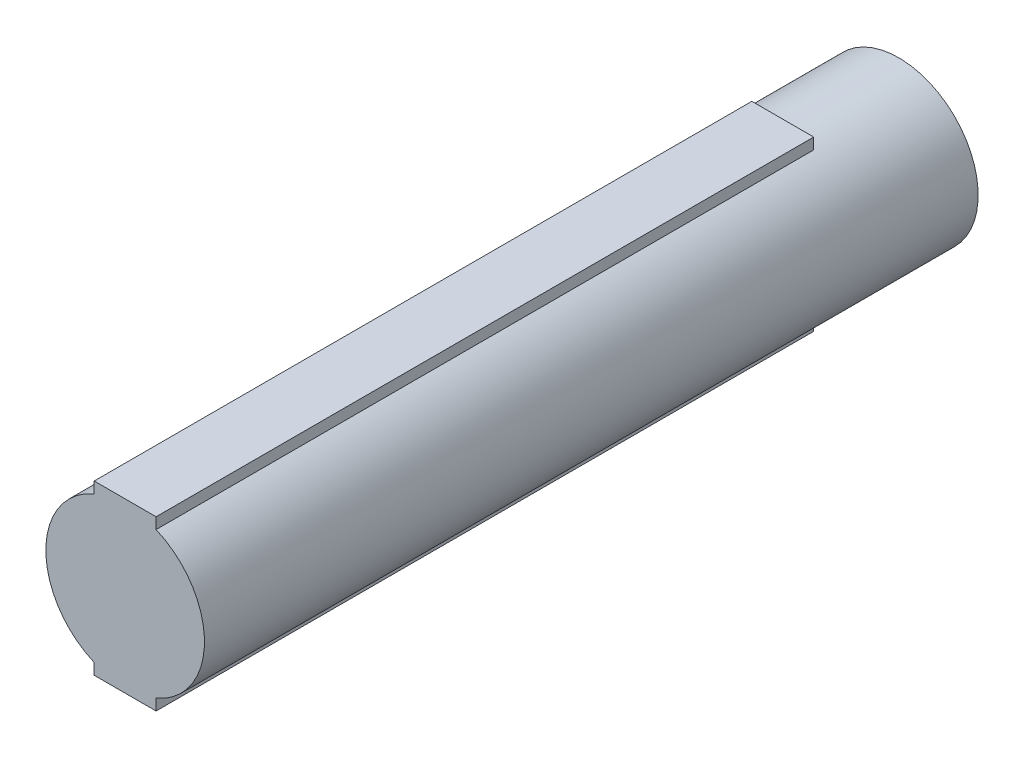
ISO-10303-21;
HEADER;
FILE_DESCRIPTION(('STEP AP214'),'2;1');
FILE_NAME('part.step','',(''),(''),'','','');
FILE_SCHEMA(('AUTOMOTIVE_DESIGN { 1 0 10303 214 1 1 1 1 }'));
ENDSEC;
DATA;
#1=APPLICATION_CONTEXT('core data for automotive mechanical design processes');
#2=APPLICATION_PROTOCOL_DEFINITION('international standard','automotive_design',2000,#1);
#3=PRODUCT_CONTEXT('',#1,'mechanical');
#4=PRODUCT('Part','Part','',(#3));
#5=PRODUCT_RELATED_PRODUCT_CATEGORY('part','',(#4));
#6=PRODUCT_DEFINITION_FORMATION('','',#4);
#7=PRODUCT_DEFINITION_CONTEXT('part definition',#1,'design');
#8=PRODUCT_DEFINITION('design','',#6,#7);
#9=PRODUCT_DEFINITION_SHAPE('','',#8);
#10=(LENGTH_UNIT() NAMED_UNIT(*) SI_UNIT(.MILLI.,.METRE.));
#11=(NAMED_UNIT(*) PLANE_ANGLE_UNIT() SI_UNIT($,.RADIAN.));
#12=(NAMED_UNIT(*) SI_UNIT($,.STERADIAN.) SOLID_ANGLE_UNIT());
#13=UNCERTAINTY_MEASURE_WITH_UNIT(LENGTH_MEASURE(1.E-05),#10,'distance_accuracy_value','');
#14=(GEOMETRIC_REPRESENTATION_CONTEXT(3) GLOBAL_UNCERTAINTY_ASSIGNED_CONTEXT((#13)) GLOBAL_UNIT_ASSIGNED_CONTEXT((#10,
#11,#12)) REPRESENTATION_CONTEXT('',''));
#15=CARTESIAN_POINT('',(0.,0.,0.));
#16=DIRECTION('',(0.,0.,1.));
#17=DIRECTION('',(1.,0.,0.));
#18=AXIS2_PLACEMENT_3D('',#15,#16,#17);
#19=CARTESIAN_POINT('',(0.,0.,0.));
#20=DIRECTION('',(0.,0.,1.));
#21=DIRECTION('',(1.,0.,0.));
#22=AXIS2_PLACEMENT_3D('',#19,#20,#21);
#23=CYLINDRICAL_SURFACE('',#22,2.05);
#24=CARTESIAN_POINT('',(0.,0.,-9.));
#25=DIRECTION('',(0.,0.,-1.));
#26=DIRECTION('',(-1.,0.,0.));
#27=AXIS2_PLACEMENT_3D('',#24,#25,#26);
#28=CIRCLE('',#27,2.05);
#29=CARTESIAN_POINT('',(-2.05,0.,-9.));
#30=VERTEX_POINT('',#29);
#31=EDGE_CURVE('E205',#30,#30,#28,.T.);
#32=ORIENTED_EDGE('',*,*,#31,.F.);
#33=EDGE_LOOP('',(#32));
#34=FACE_BOUND('',#33,.T.);
#35=CARTESIAN_POINT('',(0.,0.,-6.));
#36=DIRECTION('',(0.,0.,1.));
#37=DIRECTION('',(-1.,0.,0.));
#38=AXIS2_PLACEMENT_3D('',#35,#36,#37);
#39=CIRCLE('',#38,2.05);
#40=CARTESIAN_POINT('',(-0.800000000000007,-1.88745860881768,-6.));
#41=VERTEX_POINT('',#40);
#42=CARTESIAN_POINT('',(0.799999999999994,-1.88745860881769,-6.));
#43=VERTEX_POINT('',#42);
#44=EDGE_CURVE('E169',#41,#43,#39,.T.);
#45=ORIENTED_EDGE('',*,*,#44,.F.);
#46=DIRECTION('',(0.,0.,-1.));
#47=VECTOR('',#46,1.);
#48=CARTESIAN_POINT('',(-0.800000000000007,-1.88745860881768,11.));
#49=LINE('',#48,#47);
#50=CARTESIAN_POINT('',(-0.800000000000007,-1.88745860881768,11.));
#51=VERTEX_POINT('',#50);
#52=EDGE_CURVE('E158',#51,#41,#49,.T.);
#53=ORIENTED_EDGE('',*,*,#52,.F.);
#54=CARTESIAN_POINT('',(0.,0.,11.));
#55=DIRECTION('',(0.,0.,1.));
#56=DIRECTION('',(1.,0.,0.));
#57=AXIS2_PLACEMENT_3D('',#54,#55,#56);
#58=CIRCLE('',#57,2.05);
#59=CARTESIAN_POINT('',(-0.800000000000007,1.88745860881768,11.));
#60=VERTEX_POINT('',#59);
#61=EDGE_CURVE('E256',#60,#51,#58,.T.);
#62=ORIENTED_EDGE('',*,*,#61,.F.);
#63=DIRECTION('',(0.,0.,-1.));
#64=VECTOR('',#63,1.);
#65=CARTESIAN_POINT('',(-0.800000000000007,1.88745860881768,11.));
#66=LINE('',#65,#64);
#67=CARTESIAN_POINT('',(-0.800000000000007,1.88745860881768,-6.));
#68=VERTEX_POINT('',#67);
#69=EDGE_CURVE('E224',#60,#68,#66,.T.);
#70=ORIENTED_EDGE('',*,*,#69,.T.);
#71=CARTESIAN_POINT('',(0.,0.,-6.));
#72=DIRECTION('',(0.,0.,1.));
#73=DIRECTION('',(-1.,0.,0.));
#74=AXIS2_PLACEMENT_3D('',#71,#72,#73);
#75=CIRCLE('',#74,2.05);
#76=CARTESIAN_POINT('',(0.799999999999994,1.88745860881769,-6.));
#77=VERTEX_POINT('',#76);
#78=EDGE_CURVE('E190',#77,#68,#75,.T.);
#79=ORIENTED_EDGE('',*,*,#78,.F.);
#80=DIRECTION('',(0.,0.,-1.));
#81=VECTOR('',#80,1.);
#82=CARTESIAN_POINT('',(0.799999999999994,1.88745860881769,11.));
#83=LINE('',#82,#81);
#84=CARTESIAN_POINT('',(0.799999999999994,1.88745860881769,11.));
#85=VERTEX_POINT('',#84);
#86=EDGE_CURVE('E225',#85,#77,#83,.T.);
#87=ORIENTED_EDGE('',*,*,#86,.F.);
#88=CARTESIAN_POINT('',(0.799999999999994,-1.88745860881769,11.));
#89=VERTEX_POINT('',#88);
#90=EDGE_CURVE('E247',#89,#85,#58,.T.);
#91=ORIENTED_EDGE('',*,*,#90,.F.);
#92=DIRECTION('',(0.,0.,-1.));
#93=VECTOR('',#92,1.);
#94=CARTESIAN_POINT('',(0.799999999999994,-1.88745860881769,11.));
#95=LINE('',#94,#93);
#96=EDGE_CURVE('E245',#89,#43,#95,.T.);
#97=ORIENTED_EDGE('',*,*,#96,.T.);
#98=EDGE_LOOP('',(#45,#53,#62,#70,#79,#87,#91,#97));
#99=FACE_BOUND('',#98,.T.);
#100=ADVANCED_FACE('F56',(#34,#99),#23,.T.);
#101=CARTESIAN_POINT('',(0.,0.,11.));
#102=DIRECTION('',(0.,0.,-1.));
#103=DIRECTION('',(-1.,0.,0.));
#104=AXIS2_PLACEMENT_3D('',#101,#102,#103);
#105=PLANE('',#104);
#106=DIRECTION('',(0.,-1.,0.));
#107=VECTOR('',#106,1.);
#108=CARTESIAN_POINT('',(-0.800000000000007,0.,11.));
#109=LINE('',#108,#107);
#110=CARTESIAN_POINT('',(-0.800000000000007,2.17499999999999,11.));
#111=VERTEX_POINT('',#110);
#112=EDGE_CURVE('E215',#111,#60,#109,.T.);
#113=ORIENTED_EDGE('',*,*,#112,.T.);
#114=ORIENTED_EDGE('',*,*,#61,.T.);
#115=DIRECTION('',(0.,1.,0.));
#116=VECTOR('',#115,1.);
#117=CARTESIAN_POINT('',(-0.800000000000007,0.,11.));
#118=LINE('',#117,#116);
#119=CARTESIAN_POINT('',(-0.800000000000007,-2.17499999999999,11.));
#120=VERTEX_POINT('',#119);
#121=EDGE_CURVE('E242',#120,#51,#118,.T.);
#122=ORIENTED_EDGE('',*,*,#121,.F.);
#123=DIRECTION('',(-1.,0.,0.));
#124=VECTOR('',#123,1.);
#125=CARTESIAN_POINT('',(0.,-2.17499999999999,11.));
#126=LINE('',#125,#124);
#127=CARTESIAN_POINT('',(0.799999999999994,-2.17499999999999,11.));
#128=VERTEX_POINT('',#127);
#129=EDGE_CURVE('E153',#128,#120,#126,.T.);
#130=ORIENTED_EDGE('',*,*,#129,.F.);
#131=DIRECTION('',(0.,-1.,0.));
#132=VECTOR('',#131,1.);
#133=CARTESIAN_POINT('',(0.799999999999995,0.,11.));
#134=LINE('',#133,#132);
#135=EDGE_CURVE('E228',#89,#128,#134,.T.);
#136=ORIENTED_EDGE('',*,*,#135,.F.);
#137=ORIENTED_EDGE('',*,*,#90,.T.);
#138=DIRECTION('',(0.,1.,0.));
#139=VECTOR('',#138,1.);
#140=CARTESIAN_POINT('',(0.799999999999995,0.,11.));
#141=LINE('',#140,#139);
#142=CARTESIAN_POINT('',(0.799999999999994,2.17499999999999,11.));
#143=VERTEX_POINT('',#142);
#144=EDGE_CURVE('E221',#85,#143,#141,.T.);
#145=ORIENTED_EDGE('',*,*,#144,.T.);
#146=DIRECTION('',(-1.,0.,0.));
#147=VECTOR('',#146,1.);
#148=CARTESIAN_POINT('',(0.,2.17499999999999,11.));
#149=LINE('',#148,#147);
#150=EDGE_CURVE('E218',#143,#111,#149,.T.);
#151=ORIENTED_EDGE('',*,*,#150,.T.);
#152=EDGE_LOOP('',(#113,#114,#122,#130,#136,#137,#145,#151));
#153=FACE_BOUND('',#152,.T.);
#154=ADVANCED_FACE('F296',(#153),#105,.F.);
#155=CARTESIAN_POINT('',(-0.800000000000007,0.,11.));
#156=DIRECTION('',(-1.,0.,0.));
#157=DIRECTION('',(0.,-1.,0.));
#158=AXIS2_PLACEMENT_3D('',#155,#156,#157);
#159=PLANE('',#158);
#160=ORIENTED_EDGE('',*,*,#52,.T.);
#161=DIRECTION('',(0.,1.,0.));
#162=VECTOR('',#161,1.);
#163=CARTESIAN_POINT('',(-0.800000000000007,-2.17499999999999,-6.));
#164=LINE('',#163,#162);
#165=CARTESIAN_POINT('',(-0.800000000000007,-2.17499999999999,-6.));
#166=VERTEX_POINT('',#165);
#167=EDGE_CURVE('E162',#166,#41,#164,.T.);
#168=ORIENTED_EDGE('',*,*,#167,.F.);
#169=DIRECTION('',(0.,0.,-1.));
#170=VECTOR('',#169,1.);
#171=CARTESIAN_POINT('',(-0.800000000000007,-2.17499999999999,11.));
#172=LINE('',#171,#170);
#173=EDGE_CURVE('E147',#120,#166,#172,.T.);
#174=ORIENTED_EDGE('',*,*,#173,.F.);
#175=ORIENTED_EDGE('',*,*,#121,.T.);
#176=EDGE_LOOP('',(#160,#168,#174,#175));
#177=FACE_BOUND('',#176,.T.);
#178=ADVANCED_FACE('F163',(#177),#159,.T.);
#179=CARTESIAN_POINT('',(0.,-2.17499999999999,11.));
#180=DIRECTION('',(0.,-1.,0.));
#181=DIRECTION('',(0.,0.,-1.));
#182=AXIS2_PLACEMENT_3D('',#179,#180,#181);
#183=PLANE('',#182);
#184=ORIENTED_EDGE('',*,*,#173,.T.);
#185=DIRECTION('',(-1.,0.,0.));
#186=VECTOR('',#185,1.);
#187=CARTESIAN_POINT('',(0.799999999999994,-2.17499999999999,-6.));
#188=LINE('',#187,#186);
#189=CARTESIAN_POINT('',(0.799999999999994,-2.17499999999999,-6.));
#190=VERTEX_POINT('',#189);
#191=EDGE_CURVE('E151',#190,#166,#188,.T.);
#192=ORIENTED_EDGE('',*,*,#191,.F.);
#193=DIRECTION('',(0.,0.,-1.));
#194=VECTOR('',#193,1.);
#195=CARTESIAN_POINT('',(0.799999999999994,-2.17499999999999,11.));
#196=LINE('',#195,#194);
#197=EDGE_CURVE('E159',#128,#190,#196,.T.);
#198=ORIENTED_EDGE('',*,*,#197,.F.);
#199=ORIENTED_EDGE('',*,*,#129,.T.);
#200=EDGE_LOOP('',(#184,#192,#198,#199));
#201=FACE_BOUND('',#200,.T.);
#202=ADVANCED_FACE('F149',(#201),#183,.T.);
#203=CARTESIAN_POINT('',(0.799999999999995,0.,11.));
#204=DIRECTION('',(1.,0.,0.));
#205=DIRECTION('',(0.,1.,0.));
#206=AXIS2_PLACEMENT_3D('',#203,#204,#205);
#207=PLANE('',#206);
#208=ORIENTED_EDGE('',*,*,#197,.T.);
#209=DIRECTION('',(0.,-1.,0.));
#210=VECTOR('',#209,1.);
#211=CARTESIAN_POINT('',(0.799999999999994,-1.88745860881769,-6.));
#212=LINE('',#211,#210);
#213=EDGE_CURVE('E174',#43,#190,#212,.T.);
#214=ORIENTED_EDGE('',*,*,#213,.F.);
#215=ORIENTED_EDGE('',*,*,#96,.F.);
#216=ORIENTED_EDGE('',*,*,#135,.T.);
#217=EDGE_LOOP('',(#208,#214,#215,#216));
#218=FACE_BOUND('',#217,.T.);
#219=ADVANCED_FACE('F309',(#218),#207,.T.);
#220=CARTESIAN_POINT('',(0.799999999999995,0.,11.));
#221=DIRECTION('',(-1.,0.,0.));
#222=DIRECTION('',(0.,-1.,0.));
#223=AXIS2_PLACEMENT_3D('',#220,#221,#222);
#224=PLANE('',#223);
#225=ORIENTED_EDGE('',*,*,#86,.T.);
#226=DIRECTION('',(0.,-1.,0.));
#227=VECTOR('',#226,1.);
#228=CARTESIAN_POINT('',(0.799999999999994,2.17499999999999,-6.));
#229=LINE('',#228,#227);
#230=CARTESIAN_POINT('',(0.799999999999994,2.17499999999999,-6.));
#231=VERTEX_POINT('',#230);
#232=EDGE_CURVE('E186',#231,#77,#229,.T.);
#233=ORIENTED_EDGE('',*,*,#232,.F.);
#234=DIRECTION('',(0.,0.,-1.));
#235=VECTOR('',#234,1.);
#236=CARTESIAN_POINT('',(0.799999999999994,2.17499999999999,11.));
#237=LINE('',#236,#235);
#238=EDGE_CURVE('E229',#143,#231,#237,.T.);
#239=ORIENTED_EDGE('',*,*,#238,.F.);
#240=ORIENTED_EDGE('',*,*,#144,.F.);
#241=EDGE_LOOP('',(#225,#233,#239,#240));
#242=FACE_BOUND('',#241,.T.);
#243=ADVANCED_FACE('F332',(#242),#224,.F.);
#244=CARTESIAN_POINT('',(0.,2.17499999999999,11.));
#245=DIRECTION('',(0.,-1.,0.));
#246=DIRECTION('',(0.,0.,-1.));
#247=AXIS2_PLACEMENT_3D('',#244,#245,#246);
#248=PLANE('',#247);
#249=ORIENTED_EDGE('',*,*,#238,.T.);
#250=DIRECTION('',(1.,0.,0.));
#251=VECTOR('',#250,1.);
#252=CARTESIAN_POINT('',(-0.800000000000007,2.17499999999999,-6.));
#253=LINE('',#252,#251);
#254=CARTESIAN_POINT('',(-0.800000000000007,2.17499999999999,-6.));
#255=VERTEX_POINT('',#254);
#256=EDGE_CURVE('E182',#255,#231,#253,.T.);
#257=ORIENTED_EDGE('',*,*,#256,.F.);
#258=DIRECTION('',(0.,0.,-1.));
#259=VECTOR('',#258,1.);
#260=CARTESIAN_POINT('',(-0.800000000000007,2.17499999999999,11.));
#261=LINE('',#260,#259);
#262=EDGE_CURVE('E232',#111,#255,#261,.T.);
#263=ORIENTED_EDGE('',*,*,#262,.F.);
#264=ORIENTED_EDGE('',*,*,#150,.F.);
#265=EDGE_LOOP('',(#249,#257,#263,#264));
#266=FACE_BOUND('',#265,.T.);
#267=ADVANCED_FACE('F335',(#266),#248,.F.);
#268=CARTESIAN_POINT('',(-0.800000000000007,0.,11.));
#269=DIRECTION('',(1.,0.,0.));
#270=DIRECTION('',(0.,1.,0.));
#271=AXIS2_PLACEMENT_3D('',#268,#269,#270);
#272=PLANE('',#271);
#273=ORIENTED_EDGE('',*,*,#262,.T.);
#274=DIRECTION('',(0.,1.,0.));
#275=VECTOR('',#274,1.);
#276=CARTESIAN_POINT('',(-0.800000000000007,1.88745860881768,-6.));
#277=LINE('',#276,#275);
#278=EDGE_CURVE('E194',#68,#255,#277,.T.);
#279=ORIENTED_EDGE('',*,*,#278,.F.);
#280=ORIENTED_EDGE('',*,*,#69,.F.);
#281=ORIENTED_EDGE('',*,*,#112,.F.);
#282=EDGE_LOOP('',(#273,#279,#280,#281));
#283=FACE_BOUND('',#282,.T.);
#284=ADVANCED_FACE('F331',(#283),#272,.F.);
#285=CARTESIAN_POINT('',(0.,0.,7.));
#286=DIRECTION('',(0.,0.,-1.));
#287=DIRECTION('',(-1.,0.,0.));
#288=AXIS2_PLACEMENT_3D('',#285,#286,#287);
#289=CYLINDRICAL_SURFACE('',#288,1.6);
#290=CARTESIAN_POINT('',(0.,0.,-9.));
#291=DIRECTION('',(0.,0.,-1.));
#292=DIRECTION('',(-1.,0.,0.));
#293=AXIS2_PLACEMENT_3D('',#290,#291,#292);
#294=CIRCLE('',#293,1.6);
#295=CARTESIAN_POINT('',(1.23820658839935,1.01333333333333,-9.));
#296=VERTEX_POINT('',#295);
#297=CARTESIAN_POINT('',(-1.23820658839935,1.01333333333333,-9.));
#298=VERTEX_POINT('',#297);
#299=EDGE_CURVE('E198',#296,#298,#294,.T.);
#300=ORIENTED_EDGE('',*,*,#299,.T.);
#301=DIRECTION('',(0.,0.,-1.));
#302=VECTOR('',#301,1.);
#303=CARTESIAN_POINT('',(-1.23820658839935,1.01333333333333,7.));
#304=LINE('',#303,#302);
#305=CARTESIAN_POINT('',(-1.23820658839935,1.01333333333333,7.));
#306=VERTEX_POINT('',#305);
#307=EDGE_CURVE('E72',#298,#306,#304,.F.);
#308=ORIENTED_EDGE('',*,*,#307,.T.);
#309=CARTESIAN_POINT('',(0.,0.,7.));
#310=DIRECTION('',(0.,0.,-1.));
#311=DIRECTION('',(-1.,0.,0.));
#312=AXIS2_PLACEMENT_3D('',#309,#310,#311);
#313=CIRCLE('',#312,1.6);
#314=CARTESIAN_POINT('',(1.23820658839935,1.01333333333333,7.));
#315=VERTEX_POINT('',#314);
#316=EDGE_CURVE('E209',#315,#306,#313,.T.);
#317=ORIENTED_EDGE('',*,*,#316,.F.);
#318=DIRECTION('',(0.,0.,-1.));
#319=VECTOR('',#318,1.);
#320=CARTESIAN_POINT('',(1.23820658839935,1.01333333333333,7.));
#321=LINE('',#320,#319);
#322=EDGE_CURVE('E264',#315,#296,#321,.T.);
#323=ORIENTED_EDGE('',*,*,#322,.T.);
#324=EDGE_LOOP('',(#300,#308,#317,#323));
#325=FACE_BOUND('',#324,.T.);
#326=ADVANCED_FACE('F281',(#325),#289,.F.);
#327=CARTESIAN_POINT('',(1.20726964676496,1.05,7.));
#328=DIRECTION('',(0.,1.,0.));
#329=DIRECTION('',(0.,0.,1.));
#330=AXIS2_PLACEMENT_3D('',#327,#328,#329);
#331=PLANE('',#330);
#332=DIRECTION('',(1.,0.,0.));
#333=VECTOR('',#332,1.);
#334=CARTESIAN_POINT('',(1.20726964676496,1.05,7.));
#335=LINE('',#334,#333);
#336=CARTESIAN_POINT('',(-1.16081867662439,1.05,7.));
#337=VERTEX_POINT('',#336);
#338=CARTESIAN_POINT('',(1.16081867662439,1.05,7.));
#339=VERTEX_POINT('',#338);
#340=EDGE_CURVE('E212',#337,#339,#335,.T.);
#341=ORIENTED_EDGE('',*,*,#340,.F.);
#342=DIRECTION('',(0.,0.,1.));
#343=VECTOR('',#342,1.);
#344=CARTESIAN_POINT('',(-1.16081867662439,1.05,-9.));
#345=LINE('',#344,#343);
#346=CARTESIAN_POINT('',(-1.16081867662439,1.05,-9.));
#347=VERTEX_POINT('',#346);
#348=EDGE_CURVE('E260',#337,#347,#345,.F.);
#349=ORIENTED_EDGE('',*,*,#348,.T.);
#350=DIRECTION('',(1.,0.,0.));
#351=VECTOR('',#350,1.);
#352=CARTESIAN_POINT('',(1.20726964676496,1.05,-9.));
#353=LINE('',#352,#351);
#354=CARTESIAN_POINT('',(1.16081867662439,1.05,-9.));
#355=VERTEX_POINT('',#354);
#356=EDGE_CURVE('E201',#347,#355,#353,.T.);
#357=ORIENTED_EDGE('',*,*,#356,.T.);
#358=DIRECTION('',(0.,0.,1.));
#359=VECTOR('',#358,1.);
#360=CARTESIAN_POINT('',(1.16081867662439,1.05,7.));
#361=LINE('',#360,#359);
#362=EDGE_CURVE('E257',#355,#339,#361,.T.);
#363=ORIENTED_EDGE('',*,*,#362,.T.);
#364=EDGE_LOOP('',(#341,#349,#357,#363));
#365=FACE_BOUND('',#364,.T.);
#366=ADVANCED_FACE('F288',(#365),#331,.F.);
#367=CARTESIAN_POINT('',(0.,0.,-9.));
#368=DIRECTION('',(0.,0.,-1.));
#369=DIRECTION('',(-1.,0.,0.));
#370=AXIS2_PLACEMENT_3D('',#367,#368,#369);
#371=PLANE('',#370);
#372=ORIENTED_EDGE('',*,*,#31,.T.);
#373=EDGE_LOOP('',(#372));
#374=FACE_BOUND('',#373,.T.);
#375=ORIENTED_EDGE('',*,*,#356,.F.);
#376=CARTESIAN_POINT('',(-1.16081867662439,0.95,-9.));
#377=DIRECTION('',(0.,0.,-1.));
#378=DIRECTION('',(-1.,0.,0.));
#379=AXIS2_PLACEMENT_3D('',#376,#377,#378);
#380=CIRCLE('',#379,0.1);
#381=EDGE_CURVE('E65',#347,#298,#380,.F.);
#382=ORIENTED_EDGE('',*,*,#381,.T.);
#383=ORIENTED_EDGE('',*,*,#299,.F.);
#384=CARTESIAN_POINT('',(1.16081867662439,0.95,-9.));
#385=DIRECTION('',(0.,0.,-1.));
#386=DIRECTION('',(-1.,0.,0.));
#387=AXIS2_PLACEMENT_3D('',#384,#385,#386);
#388=CIRCLE('',#387,0.1);
#389=EDGE_CURVE('E12',#296,#355,#388,.F.);
#390=ORIENTED_EDGE('',*,*,#389,.T.);
#391=EDGE_LOOP('',(#375,#382,#383,#390));
#392=FACE_BOUND('',#391,.T.);
#393=ADVANCED_FACE('F278',(#374,#392),#371,.T.);
#394=CARTESIAN_POINT('',(0.,0.,7.));
#395=DIRECTION('',(0.,0.,-1.));
#396=DIRECTION('',(-1.,0.,0.));
#397=AXIS2_PLACEMENT_3D('',#394,#395,#396);
#398=PLANE('',#397);
#399=ORIENTED_EDGE('',*,*,#316,.T.);
#400=CARTESIAN_POINT('',(-1.16081867662439,0.95,7.));
#401=DIRECTION('',(0.,0.,-1.));
#402=DIRECTION('',(-1.,0.,0.));
#403=AXIS2_PLACEMENT_3D('',#400,#401,#402);
#404=CIRCLE('',#403,0.1);
#405=EDGE_CURVE('E272',#306,#337,#404,.T.);
#406=ORIENTED_EDGE('',*,*,#405,.T.);
#407=ORIENTED_EDGE('',*,*,#340,.T.);
#408=CARTESIAN_POINT('',(1.16081867662439,0.95,7.));
#409=DIRECTION('',(0.,0.,-1.));
#410=DIRECTION('',(-1.,0.,0.));
#411=AXIS2_PLACEMENT_3D('',#408,#409,#410);
#412=CIRCLE('',#411,0.1);
#413=EDGE_CURVE('E79',#339,#315,#412,.T.);
#414=ORIENTED_EDGE('',*,*,#413,.T.);
#415=EDGE_LOOP('',(#399,#406,#407,#414));
#416=FACE_BOUND('',#415,.T.);
#417=ADVANCED_FACE('F286',(#416),#398,.T.);
#418=CARTESIAN_POINT('',(0.,0.,-6.));
#419=DIRECTION('',(0.,0.,-1.));
#420=DIRECTION('',(-1.,0.,0.));
#421=AXIS2_PLACEMENT_3D('',#418,#419,#420);
#422=PLANE('',#421);
#423=ORIENTED_EDGE('',*,*,#256,.T.);
#424=ORIENTED_EDGE('',*,*,#232,.T.);
#425=ORIENTED_EDGE('',*,*,#78,.T.);
#426=ORIENTED_EDGE('',*,*,#278,.T.);
#427=EDGE_LOOP('',(#423,#424,#425,#426));
#428=FACE_BOUND('',#427,.T.);
#429=ADVANCED_FACE('F313',(#428),#422,.T.);
#430=CARTESIAN_POINT('',(0.,0.,-6.));
#431=DIRECTION('',(0.,0.,-1.));
#432=DIRECTION('',(-1.,0.,0.));
#433=AXIS2_PLACEMENT_3D('',#430,#431,#432);
#434=PLANE('',#433);
#435=ORIENTED_EDGE('',*,*,#191,.T.);
#436=ORIENTED_EDGE('',*,*,#167,.T.);
#437=ORIENTED_EDGE('',*,*,#44,.T.);
#438=ORIENTED_EDGE('',*,*,#213,.T.);
#439=EDGE_LOOP('',(#435,#436,#437,#438));
#440=FACE_BOUND('',#439,.T.);
#441=ADVANCED_FACE('F172',(#440),#434,.T.);
#442=CARTESIAN_POINT('',(-1.16081867662439,0.95,7.));
#443=DIRECTION('',(0.,0.,-1.));
#444=DIRECTION('',(-1.,0.,0.));
#445=AXIS2_PLACEMENT_3D('',#442,#443,#444);
#446=CYLINDRICAL_SURFACE('',#445,0.1);
#447=ORIENTED_EDGE('',*,*,#405,.F.);
#448=ORIENTED_EDGE('',*,*,#307,.F.);
#449=ORIENTED_EDGE('',*,*,#381,.F.);
#450=ORIENTED_EDGE('',*,*,#348,.F.);
#451=EDGE_LOOP('',(#447,#448,#449,#450));
#452=FACE_BOUND('',#451,.T.);
#453=ADVANCED_FACE('F284',(#452),#446,.F.);
#454=CARTESIAN_POINT('',(1.16081867662439,0.95,7.));
#455=DIRECTION('',(0.,0.,-1.));
#456=DIRECTION('',(-1.,0.,0.));
#457=AXIS2_PLACEMENT_3D('',#454,#455,#456);
#458=CYLINDRICAL_SURFACE('',#457,0.1);
#459=ORIENTED_EDGE('',*,*,#413,.F.);
#460=ORIENTED_EDGE('',*,*,#362,.F.);
#461=ORIENTED_EDGE('',*,*,#389,.F.);
#462=ORIENTED_EDGE('',*,*,#322,.F.);
#463=EDGE_LOOP('',(#459,#460,#461,#462));
#464=FACE_BOUND('',#463,.T.);
#465=ADVANCED_FACE('F58',(#464),#458,.F.);
#466=CLOSED_SHELL('',(#100,#154,#178,#202,#219,#243,#267,#284,#326,#366,#393,#417,#429,#441,
#453,#465));
#467=MANIFOLD_SOLID_BREP('B2',#466);
#468=ADVANCED_BREP_SHAPE_REPRESENTATION('',(#18,#467),#14);
#469=SHAPE_DEFINITION_REPRESENTATION(#9,#468);
ENDSEC;
END-ISO-10303-21;
